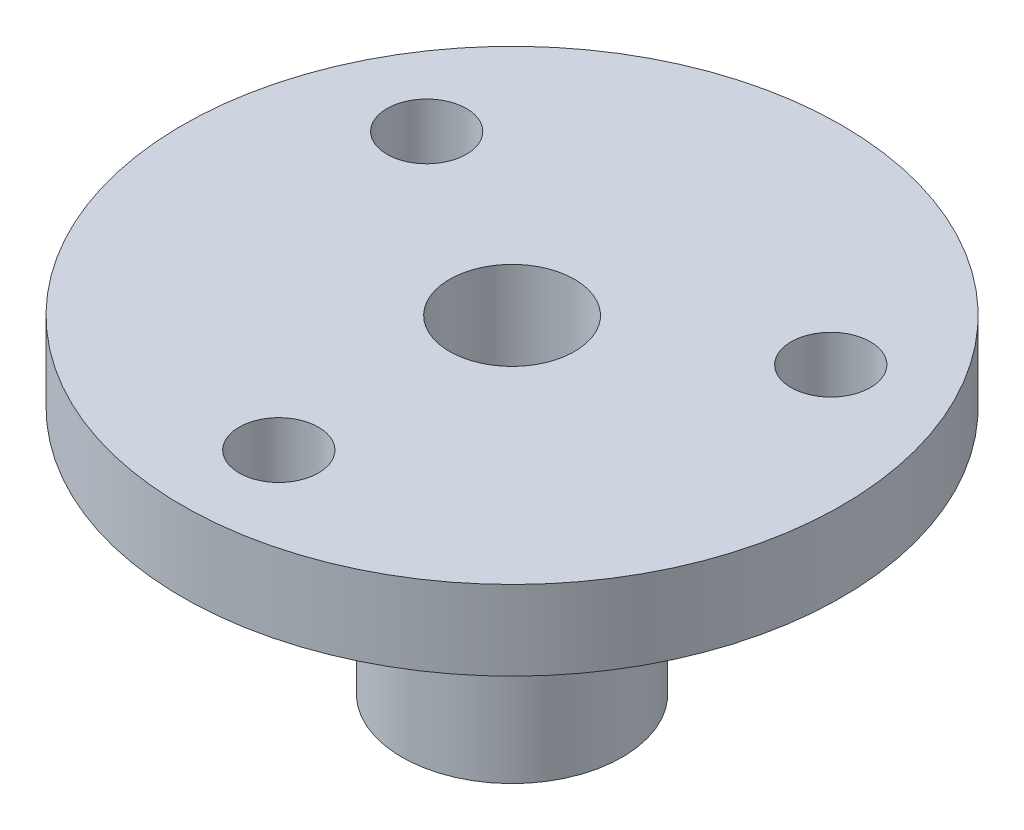
ISO-10303-21;
HEADER;
FILE_DESCRIPTION(('STEP AP214'),'2;1');
FILE_NAME('part.step','',(''),(''),'','','');
FILE_SCHEMA(('AUTOMOTIVE_DESIGN { 1 0 10303 214 1 1 1 1 }'));
ENDSEC;
DATA;
#1=APPLICATION_CONTEXT('core data for automotive mechanical design processes');
#2=APPLICATION_PROTOCOL_DEFINITION('international standard','automotive_design',2000,#1);
#3=PRODUCT_CONTEXT('',#1,'mechanical');
#4=PRODUCT('Part','Part','',(#3));
#5=PRODUCT_RELATED_PRODUCT_CATEGORY('part','',(#4));
#6=PRODUCT_DEFINITION_FORMATION('','',#4);
#7=PRODUCT_DEFINITION_CONTEXT('part definition',#1,'design');
#8=PRODUCT_DEFINITION('design','',#6,#7);
#9=PRODUCT_DEFINITION_SHAPE('','',#8);
#10=(LENGTH_UNIT() NAMED_UNIT(*) SI_UNIT(.MILLI.,.METRE.));
#11=(NAMED_UNIT(*) PLANE_ANGLE_UNIT() SI_UNIT($,.RADIAN.));
#12=(NAMED_UNIT(*) SI_UNIT($,.STERADIAN.) SOLID_ANGLE_UNIT());
#13=UNCERTAINTY_MEASURE_WITH_UNIT(LENGTH_MEASURE(1.E-05),#10,'distance_accuracy_value','');
#14=(GEOMETRIC_REPRESENTATION_CONTEXT(3) GLOBAL_UNCERTAINTY_ASSIGNED_CONTEXT((#13)) GLOBAL_UNIT_ASSIGNED_CONTEXT((#10,
#11,#12)) REPRESENTATION_CONTEXT('',''));
#15=CARTESIAN_POINT('',(0.,0.,0.));
#16=DIRECTION('',(0.,0.,1.));
#17=DIRECTION('',(1.,0.,0.));
#18=AXIS2_PLACEMENT_3D('',#15,#16,#17);
#19=CARTESIAN_POINT('',(0.,0.,0.));
#20=DIRECTION('',(0.,-1.,0.));
#21=DIRECTION('',(0.,0.,-1.));
#22=AXIS2_PLACEMENT_3D('',#19,#20,#21);
#23=CYLINDRICAL_SURFACE('',#22,16.6);
#24=CARTESIAN_POINT('',(0.,16.5,0.));
#25=DIRECTION('',(0.,-1.,0.));
#26=DIRECTION('',(0.,0.,-1.));
#27=AXIS2_PLACEMENT_3D('',#24,#25,#26);
#28=CIRCLE('',#27,16.6);
#29=CARTESIAN_POINT('',(0.,16.5,-16.6));
#30=VERTEX_POINT('',#29);
#31=EDGE_CURVE('E10',#30,#30,#28,.T.);
#32=ORIENTED_EDGE('',*,*,#31,.T.);
#33=EDGE_LOOP('',(#32));
#34=FACE_BOUND('',#33,.T.);
#35=CARTESIAN_POINT('',(0.,12.5,0.));
#36=DIRECTION('',(0.,-1.,0.));
#37=DIRECTION('',(0.,0.,-1.));
#38=AXIS2_PLACEMENT_3D('',#35,#36,#37);
#39=CIRCLE('',#38,16.6);
#40=CARTESIAN_POINT('',(0.,12.5,-16.6));
#41=VERTEX_POINT('',#40);
#42=EDGE_CURVE('E55',#41,#41,#39,.T.);
#43=ORIENTED_EDGE('',*,*,#42,.F.);
#44=EDGE_LOOP('',(#43));
#45=FACE_BOUND('',#44,.T.);
#46=ADVANCED_FACE('F30',(#34,#45),#23,.T.);
#47=CARTESIAN_POINT('',(16.6,16.5,0.));
#48=DIRECTION('',(0.,1.,0.));
#49=DIRECTION('',(0.,0.,1.));
#50=AXIS2_PLACEMENT_3D('',#47,#48,#49);
#51=PLANE('',#50);
#52=CARTESIAN_POINT('',(-10.1757984944667,16.5,-5.87500000000029));
#53=DIRECTION('',(0.,-1.,0.));
#54=DIRECTION('',(0.,0.,-1.));
#55=AXIS2_PLACEMENT_3D('',#52,#53,#54);
#56=CIRCLE('',#55,2.00000000000067);
#57=CARTESIAN_POINT('',(-10.1757984944667,16.5,-7.87500000000096));
#58=VERTEX_POINT('',#57);
#59=EDGE_CURVE('E68',#58,#58,#56,.T.);
#60=ORIENTED_EDGE('',*,*,#59,.T.);
#61=EDGE_LOOP('',(#60));
#62=FACE_BOUND('',#61,.T.);
#63=CARTESIAN_POINT('',(10.1757984944677,16.5,-5.87499999999971));
#64=DIRECTION('',(0.,-1.,0.));
#65=DIRECTION('',(0.,0.,-1.));
#66=AXIS2_PLACEMENT_3D('',#63,#64,#65);
#67=CIRCLE('',#66,2.00000000000045);
#68=CARTESIAN_POINT('',(10.1757984944677,16.5,-7.87500000000016));
#69=VERTEX_POINT('',#68);
#70=EDGE_CURVE('E62',#69,#69,#67,.T.);
#71=ORIENTED_EDGE('',*,*,#70,.T.);
#72=EDGE_LOOP('',(#71));
#73=FACE_BOUND('',#72,.T.);
#74=CARTESIAN_POINT('',(0.,16.5,11.75));
#75=DIRECTION('',(0.,-1.,0.));
#76=DIRECTION('',(0.,0.,-1.));
#77=AXIS2_PLACEMENT_3D('',#74,#75,#76);
#78=CIRCLE('',#77,2.);
#79=CARTESIAN_POINT('',(0.,16.5,9.75));
#80=VERTEX_POINT('',#79);
#81=EDGE_CURVE('E58',#80,#80,#78,.T.);
#82=ORIENTED_EDGE('',*,*,#81,.T.);
#83=EDGE_LOOP('',(#82));
#84=FACE_BOUND('',#83,.T.);
#85=CARTESIAN_POINT('',(0.,16.5,0.));
#86=DIRECTION('',(0.,-1.,0.));
#87=DIRECTION('',(0.,0.,-1.));
#88=AXIS2_PLACEMENT_3D('',#85,#86,#87);
#89=CIRCLE('',#88,3.15);
#90=CARTESIAN_POINT('',(0.,16.5,-3.15));
#91=VERTEX_POINT('',#90);
#92=EDGE_CURVE('E36',#91,#91,#89,.T.);
#93=ORIENTED_EDGE('',*,*,#92,.T.);
#94=EDGE_LOOP('',(#93));
#95=FACE_BOUND('',#94,.T.);
#96=ORIENTED_EDGE('',*,*,#31,.F.);
#97=EDGE_LOOP('',(#96));
#98=FACE_BOUND('',#97,.T.);
#99=ADVANCED_FACE('F77',(#62,#73,#84,#95,#98),#51,.T.);
#100=CARTESIAN_POINT('',(0.,0.,0.));
#101=DIRECTION('',(0.,-1.,0.));
#102=DIRECTION('',(0.,0.,-1.));
#103=AXIS2_PLACEMENT_3D('',#100,#101,#102);
#104=CYLINDRICAL_SURFACE('',#103,3.15);
#105=CARTESIAN_POINT('',(0.,0.,0.));
#106=DIRECTION('',(0.,-1.,0.));
#107=DIRECTION('',(0.,0.,-1.));
#108=AXIS2_PLACEMENT_3D('',#105,#106,#107);
#109=CIRCLE('',#108,3.15);
#110=CARTESIAN_POINT('',(0.,0.,-3.15));
#111=VERTEX_POINT('',#110);
#112=EDGE_CURVE('E40',#111,#111,#109,.T.);
#113=ORIENTED_EDGE('',*,*,#112,.T.);
#114=EDGE_LOOP('',(#113));
#115=FACE_BOUND('',#114,.T.);
#116=ORIENTED_EDGE('',*,*,#92,.F.);
#117=EDGE_LOOP('',(#116));
#118=FACE_BOUND('',#117,.T.);
#119=ADVANCED_FACE('F115',(#115,#118),#104,.F.);
#120=CARTESIAN_POINT('',(3.15,0.,0.));
#121=DIRECTION('',(0.,-1.,0.));
#122=DIRECTION('',(0.,0.,-1.));
#123=AXIS2_PLACEMENT_3D('',#120,#121,#122);
#124=PLANE('',#123);
#125=CARTESIAN_POINT('',(0.,0.,0.));
#126=DIRECTION('',(0.,-1.,0.));
#127=DIRECTION('',(0.,0.,-1.));
#128=AXIS2_PLACEMENT_3D('',#125,#126,#127);
#129=CIRCLE('',#128,5.55);
#130=CARTESIAN_POINT('',(0.,0.,-5.55));
#131=VERTEX_POINT('',#130);
#132=EDGE_CURVE('E44',#131,#131,#129,.T.);
#133=ORIENTED_EDGE('',*,*,#132,.T.);
#134=EDGE_LOOP('',(#133));
#135=FACE_BOUND('',#134,.T.);
#136=ORIENTED_EDGE('',*,*,#112,.F.);
#137=EDGE_LOOP('',(#136));
#138=FACE_BOUND('',#137,.T.);
#139=ADVANCED_FACE('F109',(#135,#138),#124,.T.);
#140=CARTESIAN_POINT('',(0.,0.,0.));
#141=DIRECTION('',(0.,-1.,0.));
#142=DIRECTION('',(0.,0.,-1.));
#143=AXIS2_PLACEMENT_3D('',#140,#141,#142);
#144=CYLINDRICAL_SURFACE('',#143,5.55);
#145=CARTESIAN_POINT('',(0.,9.99999999999999,0.));
#146=DIRECTION('',(0.,-1.,0.));
#147=DIRECTION('',(0.,0.,-1.));
#148=AXIS2_PLACEMENT_3D('',#145,#146,#147);
#149=CIRCLE('',#148,5.55);
#150=CARTESIAN_POINT('',(0.,9.99999999999999,-5.55));
#151=VERTEX_POINT('',#150);
#152=EDGE_CURVE('E49',#151,#151,#149,.T.);
#153=ORIENTED_EDGE('',*,*,#152,.T.);
#154=EDGE_LOOP('',(#153));
#155=FACE_BOUND('',#154,.T.);
#156=ORIENTED_EDGE('',*,*,#132,.F.);
#157=EDGE_LOOP('',(#156));
#158=FACE_BOUND('',#157,.T.);
#159=ADVANCED_FACE('F103',(#155,#158),#144,.T.);
#160=CARTESIAN_POINT('',(0.,10.,0.));
#161=DIRECTION('',(0.,-1.,0.));
#162=DIRECTION('',(0.,0.,-1.));
#163=AXIS2_PLACEMENT_3D('',#160,#161,#162);
#164=TOROIDAL_SURFACE('',#163,8.05,2.5);
#165=CARTESIAN_POINT('',(0.,12.5,0.));
#166=DIRECTION('',(0.,-1.,0.));
#167=DIRECTION('',(0.,0.,-1.));
#168=AXIS2_PLACEMENT_3D('',#165,#166,#167);
#169=CIRCLE('',#168,8.05000000000002);
#170=CARTESIAN_POINT('',(0.,12.5,-8.05000000000002));
#171=VERTEX_POINT('',#170);
#172=EDGE_CURVE('E52',#171,#171,#169,.T.);
#173=ORIENTED_EDGE('',*,*,#172,.T.);
#174=EDGE_LOOP('',(#173));
#175=FACE_BOUND('',#174,.T.);
#176=ORIENTED_EDGE('',*,*,#152,.F.);
#177=EDGE_LOOP('',(#176));
#178=FACE_BOUND('',#177,.T.);
#179=ADVANCED_FACE('F91',(#175,#178),#164,.F.);
#180=CARTESIAN_POINT('',(8.05000000000002,12.5,0.));
#181=DIRECTION('',(0.,-1.,0.));
#182=DIRECTION('',(0.,0.,-1.));
#183=AXIS2_PLACEMENT_3D('',#180,#181,#182);
#184=PLANE('',#183);
#185=CARTESIAN_POINT('',(-10.1757984944667,12.5,-5.87500000000029));
#186=DIRECTION('',(0.,-1.,0.));
#187=DIRECTION('',(0.,0.,-1.));
#188=AXIS2_PLACEMENT_3D('',#185,#186,#187);
#189=CIRCLE('',#188,2.00000000000067);
#190=CARTESIAN_POINT('',(-10.1757984944667,12.5,-7.87500000000096));
#191=VERTEX_POINT('',#190);
#192=EDGE_CURVE('E71',#191,#191,#189,.T.);
#193=ORIENTED_EDGE('',*,*,#192,.F.);
#194=EDGE_LOOP('',(#193));
#195=FACE_BOUND('',#194,.T.);
#196=CARTESIAN_POINT('',(10.1757984944677,12.5,-5.87499999999971));
#197=DIRECTION('',(0.,-1.,0.));
#198=DIRECTION('',(0.,0.,-1.));
#199=AXIS2_PLACEMENT_3D('',#196,#197,#198);
#200=CIRCLE('',#199,2.00000000000045);
#201=CARTESIAN_POINT('',(10.1757984944677,12.5,-7.87500000000016));
#202=VERTEX_POINT('',#201);
#203=EDGE_CURVE('E65',#202,#202,#200,.T.);
#204=ORIENTED_EDGE('',*,*,#203,.F.);
#205=EDGE_LOOP('',(#204));
#206=FACE_BOUND('',#205,.T.);
#207=CARTESIAN_POINT('',(0.,12.5,11.75));
#208=DIRECTION('',(0.,-1.,0.));
#209=DIRECTION('',(0.,0.,-1.));
#210=AXIS2_PLACEMENT_3D('',#207,#208,#209);
#211=CIRCLE('',#210,2.);
#212=CARTESIAN_POINT('',(0.,12.5,9.75));
#213=VERTEX_POINT('',#212);
#214=EDGE_CURVE('E59',#213,#213,#211,.T.);
#215=ORIENTED_EDGE('',*,*,#214,.F.);
#216=EDGE_LOOP('',(#215));
#217=FACE_BOUND('',#216,.T.);
#218=ORIENTED_EDGE('',*,*,#42,.T.);
#219=EDGE_LOOP('',(#218));
#220=FACE_BOUND('',#219,.T.);
#221=ORIENTED_EDGE('',*,*,#172,.F.);
#222=EDGE_LOOP('',(#221));
#223=FACE_BOUND('',#222,.T.);
#224=ADVANCED_FACE('F87',(#195,#206,#217,#220,#223),#184,.T.);
#225=CARTESIAN_POINT('',(0.,16.5,11.75));
#226=DIRECTION('',(0.,-1.,0.));
#227=DIRECTION('',(0.,0.,-1.));
#228=AXIS2_PLACEMENT_3D('',#225,#226,#227);
#229=CYLINDRICAL_SURFACE('',#228,2.);
#230=ORIENTED_EDGE('',*,*,#81,.F.);
#231=EDGE_LOOP('',(#230));
#232=FACE_BOUND('',#231,.T.);
#233=ORIENTED_EDGE('',*,*,#214,.T.);
#234=EDGE_LOOP('',(#233));
#235=FACE_BOUND('',#234,.T.);
#236=ADVANCED_FACE('F90',(#232,#235),#229,.F.);
#237=CARTESIAN_POINT('',(10.1757984944677,16.5,-5.87499999999971));
#238=DIRECTION('',(0.,-1.,0.));
#239=DIRECTION('',(0.,0.,-1.));
#240=AXIS2_PLACEMENT_3D('',#237,#238,#239);
#241=CYLINDRICAL_SURFACE('',#240,2.00000000000045);
#242=ORIENTED_EDGE('',*,*,#70,.F.);
#243=EDGE_LOOP('',(#242));
#244=FACE_BOUND('',#243,.T.);
#245=ORIENTED_EDGE('',*,*,#203,.T.);
#246=EDGE_LOOP('',(#245));
#247=FACE_BOUND('',#246,.T.);
#248=ADVANCED_FACE('F83',(#244,#247),#241,.F.);
#249=CARTESIAN_POINT('',(-10.1757984944667,16.5,-5.87500000000029));
#250=DIRECTION('',(0.,-1.,0.));
#251=DIRECTION('',(0.,0.,-1.));
#252=AXIS2_PLACEMENT_3D('',#249,#250,#251);
#253=CYLINDRICAL_SURFACE('',#252,2.00000000000067);
#254=ORIENTED_EDGE('',*,*,#59,.F.);
#255=EDGE_LOOP('',(#254));
#256=FACE_BOUND('',#255,.T.);
#257=ORIENTED_EDGE('',*,*,#192,.T.);
#258=EDGE_LOOP('',(#257));
#259=FACE_BOUND('',#258,.T.);
#260=ADVANCED_FACE('F80',(#256,#259),#253,.F.);
#261=CLOSED_SHELL('',(#46,#99,#119,#139,#159,#179,#224,#236,#248,#260));
#262=MANIFOLD_SOLID_BREP('B2',#261);
#263=ADVANCED_BREP_SHAPE_REPRESENTATION('',(#18,#262),#14);
#264=SHAPE_DEFINITION_REPRESENTATION(#9,#263);
ENDSEC;
END-ISO-10303-21;
